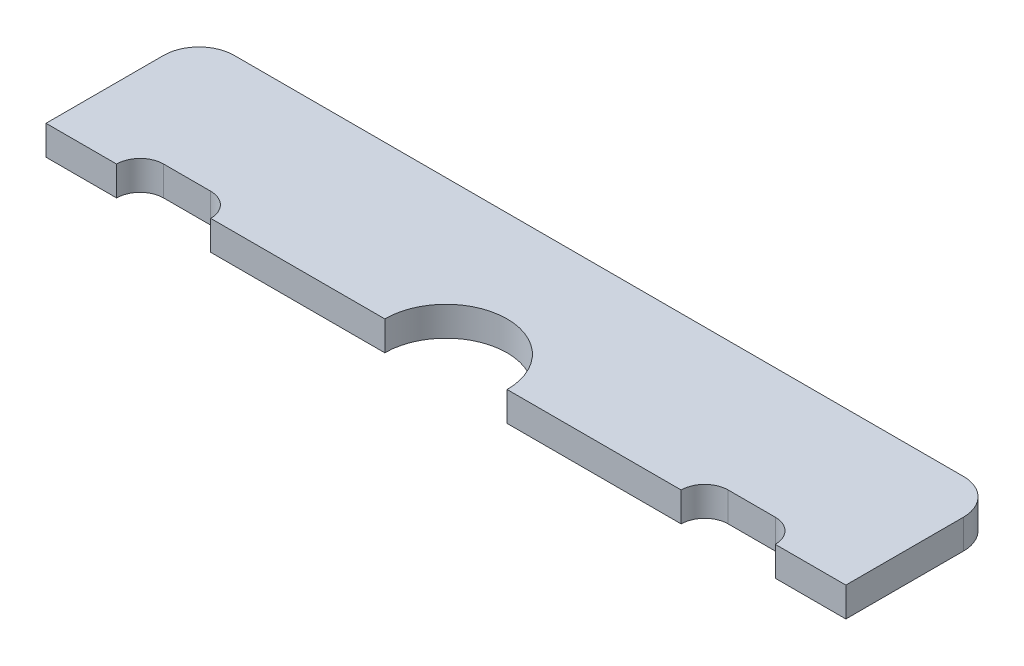
ISO-10303-21;
HEADER;
FILE_DESCRIPTION(('STEP AP214'),'2;1');
FILE_NAME('part.step','',(''),(''),'','','');
FILE_SCHEMA(('AUTOMOTIVE_DESIGN { 1 0 10303 214 1 1 1 1 }'));
ENDSEC;
DATA;
#1=APPLICATION_CONTEXT('core data for automotive mechanical design processes');
#2=APPLICATION_PROTOCOL_DEFINITION('international standard','automotive_design',2000,#1);
#3=PRODUCT_CONTEXT('',#1,'mechanical');
#4=PRODUCT('Part','Part','',(#3));
#5=PRODUCT_RELATED_PRODUCT_CATEGORY('part','',(#4));
#6=PRODUCT_DEFINITION_FORMATION('','',#4);
#7=PRODUCT_DEFINITION_CONTEXT('part definition',#1,'design');
#8=PRODUCT_DEFINITION('design','',#6,#7);
#9=PRODUCT_DEFINITION_SHAPE('','',#8);
#10=(LENGTH_UNIT() NAMED_UNIT(*) SI_UNIT(.MILLI.,.METRE.));
#11=(NAMED_UNIT(*) PLANE_ANGLE_UNIT() SI_UNIT($,.RADIAN.));
#12=(NAMED_UNIT(*) SI_UNIT($,.STERADIAN.) SOLID_ANGLE_UNIT());
#13=UNCERTAINTY_MEASURE_WITH_UNIT(LENGTH_MEASURE(1.E-05),#10,'distance_accuracy_value','');
#14=(GEOMETRIC_REPRESENTATION_CONTEXT(3) GLOBAL_UNCERTAINTY_ASSIGNED_CONTEXT((#13)) GLOBAL_UNIT_ASSIGNED_CONTEXT((#10,
#11,#12)) REPRESENTATION_CONTEXT('',''));
#15=CARTESIAN_POINT('',(0.,0.,0.));
#16=DIRECTION('',(0.,0.,1.));
#17=DIRECTION('',(1.,0.,0.));
#18=AXIS2_PLACEMENT_3D('',#15,#16,#17);
#19=CARTESIAN_POINT('',(-17.,1.25,0.));
#20=DIRECTION('',(0.,0.,-1.));
#21=DIRECTION('',(-1.,0.,0.));
#22=AXIS2_PLACEMENT_3D('',#19,#20,#21);
#23=PLANE('',#22);
#24=DIRECTION('',(1.,0.,0.));
#25=VECTOR('',#24,1.);
#26=CARTESIAN_POINT('',(-17.,0.,0.));
#27=LINE('',#26,#25);
#28=CARTESIAN_POINT('',(-17.,0.,0.));
#29=VERTEX_POINT('',#28);
#30=CARTESIAN_POINT('',(-14.,0.,0.));
#31=VERTEX_POINT('',#30);
#32=EDGE_CURVE('E188',#29,#31,#27,.T.);
#33=ORIENTED_EDGE('',*,*,#32,.T.);
#34=DIRECTION('',(0.,-1.,0.));
#35=VECTOR('',#34,1.);
#36=CARTESIAN_POINT('',(-14.,1.25,0.));
#37=LINE('',#36,#35);
#38=CARTESIAN_POINT('',(-14.,1.25,0.));
#39=VERTEX_POINT('',#38);
#40=EDGE_CURVE('E11',#39,#31,#37,.T.);
#41=ORIENTED_EDGE('',*,*,#40,.F.);
#42=DIRECTION('',(1.,0.,0.));
#43=VECTOR('',#42,1.);
#44=CARTESIAN_POINT('',(-17.,1.25,0.));
#45=LINE('',#44,#43);
#46=CARTESIAN_POINT('',(-17.,1.25,0.));
#47=VERTEX_POINT('',#46);
#48=EDGE_CURVE('E234',#47,#39,#45,.T.);
#49=ORIENTED_EDGE('',*,*,#48,.F.);
#50=DIRECTION('',(0.,-1.,0.));
#51=VECTOR('',#50,1.);
#52=CARTESIAN_POINT('',(-17.,1.25,0.));
#53=LINE('',#52,#51);
#54=EDGE_CURVE('E184',#47,#29,#53,.T.);
#55=ORIENTED_EDGE('',*,*,#54,.T.);
#56=EDGE_LOOP('',(#33,#41,#49,#55));
#57=FACE_BOUND('',#56,.T.);
#58=ADVANCED_FACE('F39',(#57),#23,.F.);
#59=CARTESIAN_POINT('',(-13.,1.25,0.));
#60=DIRECTION('',(0.,-1.,0.));
#61=DIRECTION('',(0.,0.,-1.));
#62=AXIS2_PLACEMENT_3D('',#59,#60,#61);
#63=CYLINDRICAL_SURFACE('',#62,1.);
#64=CARTESIAN_POINT('',(-13.,0.,0.));
#65=DIRECTION('',(0.,-1.,0.));
#66=DIRECTION('',(0.,0.,1.));
#67=AXIS2_PLACEMENT_3D('',#64,#65,#66);
#68=CIRCLE('',#67,1.);
#69=CARTESIAN_POINT('',(-13.,0.,-1.));
#70=VERTEX_POINT('',#69);
#71=EDGE_CURVE('E192',#31,#70,#68,.T.);
#72=ORIENTED_EDGE('',*,*,#71,.T.);
#73=DIRECTION('',(0.,-1.,0.));
#74=VECTOR('',#73,1.);
#75=CARTESIAN_POINT('',(-13.,1.25,-1.));
#76=LINE('',#75,#74);
#77=CARTESIAN_POINT('',(-13.,1.25,-1.));
#78=VERTEX_POINT('',#77);
#79=EDGE_CURVE('E48',#78,#70,#76,.T.);
#80=ORIENTED_EDGE('',*,*,#79,.F.);
#81=CARTESIAN_POINT('',(-13.,1.25,0.));
#82=DIRECTION('',(0.,-1.,0.));
#83=DIRECTION('',(0.,0.,1.));
#84=AXIS2_PLACEMENT_3D('',#81,#82,#83);
#85=CIRCLE('',#84,1.);
#86=EDGE_CURVE('E123',#39,#78,#85,.T.);
#87=ORIENTED_EDGE('',*,*,#86,.F.);
#88=ORIENTED_EDGE('',*,*,#40,.T.);
#89=EDGE_LOOP('',(#72,#80,#87,#88));
#90=FACE_BOUND('',#89,.T.);
#91=ADVANCED_FACE('F356',(#90),#63,.F.);
#92=CARTESIAN_POINT('',(-13.,1.25,-1.));
#93=DIRECTION('',(0.,0.,-1.));
#94=DIRECTION('',(-1.,0.,0.));
#95=AXIS2_PLACEMENT_3D('',#92,#93,#94);
#96=PLANE('',#95);
#97=DIRECTION('',(1.,0.,0.));
#98=VECTOR('',#97,1.);
#99=CARTESIAN_POINT('',(-13.,0.,-1.));
#100=LINE('',#99,#98);
#101=CARTESIAN_POINT('',(-11.,0.,-1.));
#102=VERTEX_POINT('',#101);
#103=EDGE_CURVE('E195',#70,#102,#100,.T.);
#104=ORIENTED_EDGE('',*,*,#103,.T.);
#105=DIRECTION('',(0.,-1.,0.));
#106=VECTOR('',#105,1.);
#107=CARTESIAN_POINT('',(-11.,1.25,-1.));
#108=LINE('',#107,#106);
#109=CARTESIAN_POINT('',(-11.,1.25,-1.));
#110=VERTEX_POINT('',#109);
#111=EDGE_CURVE('E277',#110,#102,#108,.T.);
#112=ORIENTED_EDGE('',*,*,#111,.F.);
#113=DIRECTION('',(1.,0.,0.));
#114=VECTOR('',#113,1.);
#115=CARTESIAN_POINT('',(-13.,1.25,-1.));
#116=LINE('',#115,#114);
#117=EDGE_CURVE('E287',#78,#110,#116,.T.);
#118=ORIENTED_EDGE('',*,*,#117,.F.);
#119=ORIENTED_EDGE('',*,*,#79,.T.);
#120=EDGE_LOOP('',(#104,#112,#118,#119));
#121=FACE_BOUND('',#120,.T.);
#122=ADVANCED_FACE('F285',(#121),#96,.F.);
#123=CARTESIAN_POINT('',(-11.,1.25,0.));
#124=DIRECTION('',(0.,-1.,0.));
#125=DIRECTION('',(0.,0.,-1.));
#126=AXIS2_PLACEMENT_3D('',#123,#124,#125);
#127=CYLINDRICAL_SURFACE('',#126,1.);
#128=CARTESIAN_POINT('',(-11.,0.,0.));
#129=DIRECTION('',(0.,-1.,0.));
#130=DIRECTION('',(0.,0.,1.));
#131=AXIS2_PLACEMENT_3D('',#128,#129,#130);
#132=CIRCLE('',#131,1.);
#133=CARTESIAN_POINT('',(-9.99999999999998,0.,0.));
#134=VERTEX_POINT('',#133);
#135=EDGE_CURVE('E198',#102,#134,#132,.T.);
#136=ORIENTED_EDGE('',*,*,#135,.T.);
#137=DIRECTION('',(0.,-1.,0.));
#138=VECTOR('',#137,1.);
#139=CARTESIAN_POINT('',(-9.99999999999998,1.25,0.));
#140=LINE('',#139,#138);
#141=CARTESIAN_POINT('',(-9.99999999999998,1.25,0.));
#142=VERTEX_POINT('',#141);
#143=EDGE_CURVE('E273',#142,#134,#140,.T.);
#144=ORIENTED_EDGE('',*,*,#143,.F.);
#145=CARTESIAN_POINT('',(-11.,1.25,0.));
#146=DIRECTION('',(0.,-1.,0.));
#147=DIRECTION('',(0.,0.,1.));
#148=AXIS2_PLACEMENT_3D('',#145,#146,#147);
#149=CIRCLE('',#148,1.);
#150=EDGE_CURVE('E306',#110,#142,#149,.T.);
#151=ORIENTED_EDGE('',*,*,#150,.F.);
#152=ORIENTED_EDGE('',*,*,#111,.T.);
#153=EDGE_LOOP('',(#136,#144,#151,#152));
#154=FACE_BOUND('',#153,.T.);
#155=ADVANCED_FACE('F296',(#154),#127,.F.);
#156=CARTESIAN_POINT('',(-9.99999999999998,1.25,0.));
#157=DIRECTION('',(0.,0.,-1.));
#158=DIRECTION('',(-1.,0.,0.));
#159=AXIS2_PLACEMENT_3D('',#156,#157,#158);
#160=PLANE('',#159);
#161=DIRECTION('',(1.,0.,0.));
#162=VECTOR('',#161,1.);
#163=CARTESIAN_POINT('',(-9.99999999999998,0.,0.));
#164=LINE('',#163,#162);
#165=CARTESIAN_POINT('',(-2.60000000000001,0.,0.));
#166=VERTEX_POINT('',#165);
#167=EDGE_CURVE('E201',#134,#166,#164,.T.);
#168=ORIENTED_EDGE('',*,*,#167,.T.);
#169=DIRECTION('',(0.,-1.,0.));
#170=VECTOR('',#169,1.);
#171=CARTESIAN_POINT('',(-2.60000000000001,1.25,0.));
#172=LINE('',#171,#170);
#173=CARTESIAN_POINT('',(-2.60000000000001,1.25,0.));
#174=VERTEX_POINT('',#173);
#175=EDGE_CURVE('E269',#174,#166,#172,.T.);
#176=ORIENTED_EDGE('',*,*,#175,.F.);
#177=DIRECTION('',(1.,0.,0.));
#178=VECTOR('',#177,1.);
#179=CARTESIAN_POINT('',(-9.99999999999998,1.25,0.));
#180=LINE('',#179,#178);
#181=EDGE_CURVE('E302',#142,#174,#180,.T.);
#182=ORIENTED_EDGE('',*,*,#181,.F.);
#183=ORIENTED_EDGE('',*,*,#143,.T.);
#184=EDGE_LOOP('',(#168,#176,#182,#183));
#185=FACE_BOUND('',#184,.T.);
#186=ADVANCED_FACE('F300',(#185),#160,.F.);
#187=CARTESIAN_POINT('',(0.,1.25,0.));
#188=DIRECTION('',(0.,-1.,0.));
#189=DIRECTION('',(0.,0.,-1.));
#190=AXIS2_PLACEMENT_3D('',#187,#188,#189);
#191=CYLINDRICAL_SURFACE('',#190,2.6);
#192=CARTESIAN_POINT('',(0.,0.,0.));
#193=DIRECTION('',(0.,-1.,0.));
#194=DIRECTION('',(0.,0.,1.));
#195=AXIS2_PLACEMENT_3D('',#192,#193,#194);
#196=CIRCLE('',#195,2.6);
#197=CARTESIAN_POINT('',(2.59999999999999,0.,0.));
#198=VERTEX_POINT('',#197);
#199=EDGE_CURVE('E204',#166,#198,#196,.T.);
#200=ORIENTED_EDGE('',*,*,#199,.T.);
#201=DIRECTION('',(0.,-1.,0.));
#202=VECTOR('',#201,1.);
#203=CARTESIAN_POINT('',(2.59999999999999,1.25,0.));
#204=LINE('',#203,#202);
#205=CARTESIAN_POINT('',(2.59999999999999,1.25,0.));
#206=VERTEX_POINT('',#205);
#207=EDGE_CURVE('E265',#206,#198,#204,.T.);
#208=ORIENTED_EDGE('',*,*,#207,.F.);
#209=CARTESIAN_POINT('',(0.,1.25,0.));
#210=DIRECTION('',(0.,-1.,0.));
#211=DIRECTION('',(0.,0.,1.));
#212=AXIS2_PLACEMENT_3D('',#209,#210,#211);
#213=CIRCLE('',#212,2.6);
#214=EDGE_CURVE('E305',#174,#206,#213,.T.);
#215=ORIENTED_EDGE('',*,*,#214,.F.);
#216=ORIENTED_EDGE('',*,*,#175,.T.);
#217=EDGE_LOOP('',(#200,#208,#215,#216));
#218=FACE_BOUND('',#217,.T.);
#219=ADVANCED_FACE('F369',(#218),#191,.F.);
#220=CARTESIAN_POINT('',(2.59999999999999,1.25,0.));
#221=DIRECTION('',(0.,0.,-1.));
#222=DIRECTION('',(-1.,0.,0.));
#223=AXIS2_PLACEMENT_3D('',#220,#221,#222);
#224=PLANE('',#223);
#225=DIRECTION('',(1.,0.,0.));
#226=VECTOR('',#225,1.);
#227=CARTESIAN_POINT('',(2.59999999999999,0.,0.));
#228=LINE('',#227,#226);
#229=CARTESIAN_POINT('',(9.99999999999998,0.,0.));
#230=VERTEX_POINT('',#229);
#231=EDGE_CURVE('E207',#198,#230,#228,.T.);
#232=ORIENTED_EDGE('',*,*,#231,.T.);
#233=DIRECTION('',(0.,-1.,0.));
#234=VECTOR('',#233,1.);
#235=CARTESIAN_POINT('',(9.99999999999998,1.25,0.));
#236=LINE('',#235,#234);
#237=CARTESIAN_POINT('',(9.99999999999998,1.25,0.));
#238=VERTEX_POINT('',#237);
#239=EDGE_CURVE('E261',#238,#230,#236,.T.);
#240=ORIENTED_EDGE('',*,*,#239,.F.);
#241=DIRECTION('',(1.,0.,0.));
#242=VECTOR('',#241,1.);
#243=CARTESIAN_POINT('',(2.59999999999999,1.25,0.));
#244=LINE('',#243,#242);
#245=EDGE_CURVE('E310',#206,#238,#244,.T.);
#246=ORIENTED_EDGE('',*,*,#245,.F.);
#247=ORIENTED_EDGE('',*,*,#207,.T.);
#248=EDGE_LOOP('',(#232,#240,#246,#247));
#249=FACE_BOUND('',#248,.T.);
#250=ADVANCED_FACE('F372',(#249),#224,.F.);
#251=CARTESIAN_POINT('',(11.,1.25,0.));
#252=DIRECTION('',(0.,-1.,0.));
#253=DIRECTION('',(0.,0.,-1.));
#254=AXIS2_PLACEMENT_3D('',#251,#252,#253);
#255=CYLINDRICAL_SURFACE('',#254,1.);
#256=CARTESIAN_POINT('',(11.,0.,0.));
#257=DIRECTION('',(0.,-1.,0.));
#258=DIRECTION('',(0.,0.,1.));
#259=AXIS2_PLACEMENT_3D('',#256,#257,#258);
#260=CIRCLE('',#259,1.);
#261=CARTESIAN_POINT('',(11.,0.,-1.));
#262=VERTEX_POINT('',#261);
#263=EDGE_CURVE('E210',#230,#262,#260,.T.);
#264=ORIENTED_EDGE('',*,*,#263,.T.);
#265=DIRECTION('',(0.,-1.,0.));
#266=VECTOR('',#265,1.);
#267=CARTESIAN_POINT('',(11.,1.25,-1.));
#268=LINE('',#267,#266);
#269=CARTESIAN_POINT('',(11.,1.25,-1.));
#270=VERTEX_POINT('',#269);
#271=EDGE_CURVE('E257',#270,#262,#268,.T.);
#272=ORIENTED_EDGE('',*,*,#271,.F.);
#273=CARTESIAN_POINT('',(11.,1.25,0.));
#274=DIRECTION('',(0.,-1.,0.));
#275=DIRECTION('',(0.,0.,1.));
#276=AXIS2_PLACEMENT_3D('',#273,#274,#275);
#277=CIRCLE('',#276,1.);
#278=EDGE_CURVE('E317',#238,#270,#277,.T.);
#279=ORIENTED_EDGE('',*,*,#278,.F.);
#280=ORIENTED_EDGE('',*,*,#239,.T.);
#281=EDGE_LOOP('',(#264,#272,#279,#280));
#282=FACE_BOUND('',#281,.T.);
#283=ADVANCED_FACE('F376',(#282),#255,.F.);
#284=CARTESIAN_POINT('',(11.,1.25,-1.));
#285=DIRECTION('',(0.,0.,-1.));
#286=DIRECTION('',(-1.,0.,0.));
#287=AXIS2_PLACEMENT_3D('',#284,#285,#286);
#288=PLANE('',#287);
#289=DIRECTION('',(1.,0.,0.));
#290=VECTOR('',#289,1.);
#291=CARTESIAN_POINT('',(11.,0.,-1.));
#292=LINE('',#291,#290);
#293=CARTESIAN_POINT('',(13.,0.,-0.999999999999999));
#294=VERTEX_POINT('',#293);
#295=EDGE_CURVE('E213',#262,#294,#292,.T.);
#296=ORIENTED_EDGE('',*,*,#295,.T.);
#297=DIRECTION('',(0.,-1.,0.));
#298=VECTOR('',#297,1.);
#299=CARTESIAN_POINT('',(13.,1.25,-0.999999999999999));
#300=LINE('',#299,#298);
#301=CARTESIAN_POINT('',(13.,1.25,-0.999999999999999));
#302=VERTEX_POINT('',#301);
#303=EDGE_CURVE('E253',#302,#294,#300,.T.);
#304=ORIENTED_EDGE('',*,*,#303,.F.);
#305=DIRECTION('',(1.,0.,0.));
#306=VECTOR('',#305,1.);
#307=CARTESIAN_POINT('',(11.,1.25,-1.));
#308=LINE('',#307,#306);
#309=EDGE_CURVE('E320',#270,#302,#308,.T.);
#310=ORIENTED_EDGE('',*,*,#309,.F.);
#311=ORIENTED_EDGE('',*,*,#271,.T.);
#312=EDGE_LOOP('',(#296,#304,#310,#311));
#313=FACE_BOUND('',#312,.T.);
#314=ADVANCED_FACE('F380',(#313),#288,.F.);
#315=CARTESIAN_POINT('',(13.,1.25,0.));
#316=DIRECTION('',(0.,-1.,0.));
#317=DIRECTION('',(0.,0.,-1.));
#318=AXIS2_PLACEMENT_3D('',#315,#316,#317);
#319=CYLINDRICAL_SURFACE('',#318,0.999999999999999);
#320=CARTESIAN_POINT('',(13.,0.,0.));
#321=DIRECTION('',(0.,-1.,0.));
#322=DIRECTION('',(0.,0.,1.));
#323=AXIS2_PLACEMENT_3D('',#320,#321,#322);
#324=CIRCLE('',#323,0.999999999999999);
#325=CARTESIAN_POINT('',(14.,0.,0.));
#326=VERTEX_POINT('',#325);
#327=EDGE_CURVE('E216',#294,#326,#324,.T.);
#328=ORIENTED_EDGE('',*,*,#327,.T.);
#329=DIRECTION('',(0.,-1.,0.));
#330=VECTOR('',#329,1.);
#331=CARTESIAN_POINT('',(14.,1.25,0.));
#332=LINE('',#331,#330);
#333=CARTESIAN_POINT('',(14.,1.25,0.));
#334=VERTEX_POINT('',#333);
#335=EDGE_CURVE('E249',#334,#326,#332,.T.);
#336=ORIENTED_EDGE('',*,*,#335,.F.);
#337=CARTESIAN_POINT('',(13.,1.25,0.));
#338=DIRECTION('',(0.,-1.,0.));
#339=DIRECTION('',(0.,0.,1.));
#340=AXIS2_PLACEMENT_3D('',#337,#338,#339);
#341=CIRCLE('',#340,0.999999999999999);
#342=EDGE_CURVE('E323',#302,#334,#341,.T.);
#343=ORIENTED_EDGE('',*,*,#342,.F.);
#344=ORIENTED_EDGE('',*,*,#303,.T.);
#345=EDGE_LOOP('',(#328,#336,#343,#344));
#346=FACE_BOUND('',#345,.T.);
#347=ADVANCED_FACE('F384',(#346),#319,.F.);
#348=CARTESIAN_POINT('',(14.,1.25,0.));
#349=DIRECTION('',(0.,0.,-1.));
#350=DIRECTION('',(-1.,0.,0.));
#351=AXIS2_PLACEMENT_3D('',#348,#349,#350);
#352=PLANE('',#351);
#353=DIRECTION('',(1.,0.,0.));
#354=VECTOR('',#353,1.);
#355=CARTESIAN_POINT('',(14.,0.,0.));
#356=LINE('',#355,#354);
#357=CARTESIAN_POINT('',(17.,0.,0.));
#358=VERTEX_POINT('',#357);
#359=EDGE_CURVE('E219',#326,#358,#356,.T.);
#360=ORIENTED_EDGE('',*,*,#359,.T.);
#361=DIRECTION('',(0.,-1.,0.));
#362=VECTOR('',#361,1.);
#363=CARTESIAN_POINT('',(17.,1.25,0.));
#364=LINE('',#363,#362);
#365=CARTESIAN_POINT('',(17.,1.25,0.));
#366=VERTEX_POINT('',#365);
#367=EDGE_CURVE('E245',#366,#358,#364,.T.);
#368=ORIENTED_EDGE('',*,*,#367,.F.);
#369=DIRECTION('',(1.,0.,0.));
#370=VECTOR('',#369,1.);
#371=CARTESIAN_POINT('',(14.,1.25,0.));
#372=LINE('',#371,#370);
#373=EDGE_CURVE('E326',#334,#366,#372,.T.);
#374=ORIENTED_EDGE('',*,*,#373,.F.);
#375=ORIENTED_EDGE('',*,*,#335,.T.);
#376=EDGE_LOOP('',(#360,#368,#374,#375));
#377=FACE_BOUND('',#376,.T.);
#378=ADVANCED_FACE('F388',(#377),#352,.F.);
#379=CARTESIAN_POINT('',(17.,1.25,-4.99999999999999));
#380=DIRECTION('',(-1.,0.,0.));
#381=DIRECTION('',(0.,0.,1.));
#382=AXIS2_PLACEMENT_3D('',#379,#380,#381);
#383=PLANE('',#382);
#384=DIRECTION('',(0.,0.,-1.));
#385=VECTOR('',#384,1.);
#386=CARTESIAN_POINT('',(17.,0.,-4.99999999999999));
#387=LINE('',#386,#385);
#388=CARTESIAN_POINT('',(17.,0.,-4.99999999999999));
#389=VERTEX_POINT('',#388);
#390=EDGE_CURVE('E222',#358,#389,#387,.T.);
#391=ORIENTED_EDGE('',*,*,#390,.T.);
#392=DIRECTION('',(0.,-1.,0.));
#393=VECTOR('',#392,1.);
#394=CARTESIAN_POINT('',(17.,1.25,-4.99999999999999));
#395=LINE('',#394,#393);
#396=CARTESIAN_POINT('',(17.,1.25,-4.99999999999999));
#397=VERTEX_POINT('',#396);
#398=EDGE_CURVE('E241',#397,#389,#395,.T.);
#399=ORIENTED_EDGE('',*,*,#398,.F.);
#400=DIRECTION('',(0.,0.,-1.));
#401=VECTOR('',#400,1.);
#402=CARTESIAN_POINT('',(17.,1.25,-4.99999999999999));
#403=LINE('',#402,#401);
#404=EDGE_CURVE('E329',#366,#397,#403,.T.);
#405=ORIENTED_EDGE('',*,*,#404,.F.);
#406=ORIENTED_EDGE('',*,*,#367,.T.);
#407=EDGE_LOOP('',(#391,#399,#405,#406));
#408=FACE_BOUND('',#407,.T.);
#409=ADVANCED_FACE('F337',(#408),#383,.F.);
#410=CARTESIAN_POINT('',(15.5,1.25,-5.));
#411=DIRECTION('',(0.,-1.,0.));
#412=DIRECTION('',(0.,0.,-1.));
#413=AXIS2_PLACEMENT_3D('',#410,#411,#412);
#414=CYLINDRICAL_SURFACE('',#413,1.5);
#415=CARTESIAN_POINT('',(15.5,0.,-5.));
#416=DIRECTION('',(0.,1.,0.));
#417=DIRECTION('',(0.,0.,-1.));
#418=AXIS2_PLACEMENT_3D('',#415,#416,#417);
#419=CIRCLE('',#418,1.5);
#420=CARTESIAN_POINT('',(15.5,0.,-6.5));
#421=VERTEX_POINT('',#420);
#422=EDGE_CURVE('E225',#389,#421,#419,.T.);
#423=ORIENTED_EDGE('',*,*,#422,.T.);
#424=DIRECTION('',(0.,-1.,0.));
#425=VECTOR('',#424,1.);
#426=CARTESIAN_POINT('',(15.5,1.25,-6.5));
#427=LINE('',#426,#425);
#428=CARTESIAN_POINT('',(15.5,1.25,-6.5));
#429=VERTEX_POINT('',#428);
#430=EDGE_CURVE('E177',#429,#421,#427,.T.);
#431=ORIENTED_EDGE('',*,*,#430,.F.);
#432=CARTESIAN_POINT('',(15.5,1.25,-5.));
#433=DIRECTION('',(0.,1.,0.));
#434=DIRECTION('',(0.,0.,-1.));
#435=AXIS2_PLACEMENT_3D('',#432,#433,#434);
#436=CIRCLE('',#435,1.5);
#437=EDGE_CURVE('E166',#397,#429,#436,.T.);
#438=ORIENTED_EDGE('',*,*,#437,.F.);
#439=ORIENTED_EDGE('',*,*,#398,.T.);
#440=EDGE_LOOP('',(#423,#431,#438,#439));
#441=FACE_BOUND('',#440,.T.);
#442=ADVANCED_FACE('F341',(#441),#414,.T.);
#443=CARTESIAN_POINT('',(-15.5,1.25,-6.5));
#444=DIRECTION('',(0.,0.,1.));
#445=DIRECTION('',(1.,0.,0.));
#446=AXIS2_PLACEMENT_3D('',#443,#444,#445);
#447=PLANE('',#446);
#448=DIRECTION('',(-1.,0.,0.));
#449=VECTOR('',#448,1.);
#450=CARTESIAN_POINT('',(-15.5,0.,-6.5));
#451=LINE('',#450,#449);
#452=CARTESIAN_POINT('',(-15.5,0.,-6.5));
#453=VERTEX_POINT('',#452);
#454=EDGE_CURVE('E175',#421,#453,#451,.T.);
#455=ORIENTED_EDGE('',*,*,#454,.T.);
#456=DIRECTION('',(0.,-1.,0.));
#457=VECTOR('',#456,1.);
#458=CARTESIAN_POINT('',(-15.5,1.25,-6.5));
#459=LINE('',#458,#457);
#460=CARTESIAN_POINT('',(-15.5,1.25,-6.5));
#461=VERTEX_POINT('',#460);
#462=EDGE_CURVE('E172',#461,#453,#459,.T.);
#463=ORIENTED_EDGE('',*,*,#462,.F.);
#464=DIRECTION('',(-1.,0.,0.));
#465=VECTOR('',#464,1.);
#466=CARTESIAN_POINT('',(-15.5,1.25,-6.5));
#467=LINE('',#466,#465);
#468=EDGE_CURVE('E160',#429,#461,#467,.T.);
#469=ORIENTED_EDGE('',*,*,#468,.F.);
#470=ORIENTED_EDGE('',*,*,#430,.T.);
#471=EDGE_LOOP('',(#455,#463,#469,#470));
#472=FACE_BOUND('',#471,.T.);
#473=ADVANCED_FACE('F173',(#472),#447,.F.);
#474=CARTESIAN_POINT('',(-15.5,1.25,-5.));
#475=DIRECTION('',(0.,-1.,0.));
#476=DIRECTION('',(0.,0.,-1.));
#477=AXIS2_PLACEMENT_3D('',#474,#475,#476);
#478=CYLINDRICAL_SURFACE('',#477,1.5);
#479=CARTESIAN_POINT('',(-15.5,0.,-5.));
#480=DIRECTION('',(0.,1.,0.));
#481=DIRECTION('',(0.,0.,1.));
#482=AXIS2_PLACEMENT_3D('',#479,#480,#481);
#483=CIRCLE('',#482,1.5);
#484=CARTESIAN_POINT('',(-17.,0.,-4.99999999999999));
#485=VERTEX_POINT('',#484);
#486=EDGE_CURVE('E109',#453,#485,#483,.T.);
#487=ORIENTED_EDGE('',*,*,#486,.T.);
#488=DIRECTION('',(0.,-1.,0.));
#489=VECTOR('',#488,1.);
#490=CARTESIAN_POINT('',(-17.,1.25,-4.99999999999999));
#491=LINE('',#490,#489);
#492=CARTESIAN_POINT('',(-17.,1.25,-4.99999999999999));
#493=VERTEX_POINT('',#492);
#494=EDGE_CURVE('E178',#493,#485,#491,.T.);
#495=ORIENTED_EDGE('',*,*,#494,.F.);
#496=CARTESIAN_POINT('',(-15.5,1.25,-5.));
#497=DIRECTION('',(0.,1.,0.));
#498=DIRECTION('',(0.,0.,1.));
#499=AXIS2_PLACEMENT_3D('',#496,#497,#498);
#500=CIRCLE('',#499,1.5);
#501=EDGE_CURVE('E164',#461,#493,#500,.T.);
#502=ORIENTED_EDGE('',*,*,#501,.F.);
#503=ORIENTED_EDGE('',*,*,#462,.T.);
#504=EDGE_LOOP('',(#487,#495,#502,#503));
#505=FACE_BOUND('',#504,.T.);
#506=ADVANCED_FACE('F180',(#505),#478,.T.);
#507=CARTESIAN_POINT('',(-17.,1.25,-4.99999999999999));
#508=DIRECTION('',(1.,0.,0.));
#509=DIRECTION('',(0.,0.,-1.));
#510=AXIS2_PLACEMENT_3D('',#507,#508,#509);
#511=PLANE('',#510);
#512=DIRECTION('',(0.,0.,1.));
#513=VECTOR('',#512,1.);
#514=CARTESIAN_POINT('',(-17.,0.,-4.99999999999999));
#515=LINE('',#514,#513);
#516=EDGE_CURVE('E115',#485,#29,#515,.T.);
#517=ORIENTED_EDGE('',*,*,#516,.T.);
#518=ORIENTED_EDGE('',*,*,#54,.F.);
#519=DIRECTION('',(0.,0.,1.));
#520=VECTOR('',#519,1.);
#521=CARTESIAN_POINT('',(-17.,1.25,-4.99999999999999));
#522=LINE('',#521,#520);
#523=EDGE_CURVE('E56',#493,#47,#522,.T.);
#524=ORIENTED_EDGE('',*,*,#523,.F.);
#525=ORIENTED_EDGE('',*,*,#494,.T.);
#526=EDGE_LOOP('',(#517,#518,#524,#525));
#527=FACE_BOUND('',#526,.T.);
#528=ADVANCED_FACE('F345',(#527),#511,.F.);
#529=CARTESIAN_POINT('',(-13.,1.25,0.));
#530=DIRECTION('',(0.,1.,0.));
#531=DIRECTION('',(0.,0.,1.));
#532=AXIS2_PLACEMENT_3D('',#529,#530,#531);
#533=PLANE('',#532);
#534=ORIENTED_EDGE('',*,*,#48,.T.);
#535=ORIENTED_EDGE('',*,*,#86,.T.);
#536=ORIENTED_EDGE('',*,*,#117,.T.);
#537=ORIENTED_EDGE('',*,*,#150,.T.);
#538=ORIENTED_EDGE('',*,*,#181,.T.);
#539=ORIENTED_EDGE('',*,*,#214,.T.);
#540=ORIENTED_EDGE('',*,*,#245,.T.);
#541=ORIENTED_EDGE('',*,*,#278,.T.);
#542=ORIENTED_EDGE('',*,*,#309,.T.);
#543=ORIENTED_EDGE('',*,*,#342,.T.);
#544=ORIENTED_EDGE('',*,*,#373,.T.);
#545=ORIENTED_EDGE('',*,*,#404,.T.);
#546=ORIENTED_EDGE('',*,*,#437,.T.);
#547=ORIENTED_EDGE('',*,*,#468,.T.);
#548=ORIENTED_EDGE('',*,*,#501,.T.);
#549=ORIENTED_EDGE('',*,*,#523,.T.);
#550=EDGE_LOOP('',(#534,#535,#536,#537,#538,#539,#540,#541,#542,#543,#544,#545,#546,#547,#548,#549));
#551=FACE_BOUND('',#550,.T.);
#552=ADVANCED_FACE('F162',(#551),#533,.T.);
#553=CARTESIAN_POINT('',(-13.,0.,0.));
#554=DIRECTION('',(0.,1.,0.));
#555=DIRECTION('',(0.,0.,1.));
#556=AXIS2_PLACEMENT_3D('',#553,#554,#555);
#557=PLANE('',#556);
#558=ORIENTED_EDGE('',*,*,#32,.F.);
#559=ORIENTED_EDGE('',*,*,#516,.F.);
#560=ORIENTED_EDGE('',*,*,#486,.F.);
#561=ORIENTED_EDGE('',*,*,#454,.F.);
#562=ORIENTED_EDGE('',*,*,#422,.F.);
#563=ORIENTED_EDGE('',*,*,#390,.F.);
#564=ORIENTED_EDGE('',*,*,#359,.F.);
#565=ORIENTED_EDGE('',*,*,#327,.F.);
#566=ORIENTED_EDGE('',*,*,#295,.F.);
#567=ORIENTED_EDGE('',*,*,#263,.F.);
#568=ORIENTED_EDGE('',*,*,#231,.F.);
#569=ORIENTED_EDGE('',*,*,#199,.F.);
#570=ORIENTED_EDGE('',*,*,#167,.F.);
#571=ORIENTED_EDGE('',*,*,#135,.F.);
#572=ORIENTED_EDGE('',*,*,#103,.F.);
#573=ORIENTED_EDGE('',*,*,#71,.F.);
#574=EDGE_LOOP('',(#558,#559,#560,#561,#562,#563,#564,#565,#566,#567,#568,#569,#570,#571,#572,#573));
#575=FACE_BOUND('',#574,.T.);
#576=ADVANCED_FACE('F291',(#575),#557,.F.);
#577=CLOSED_SHELL('',(#58,#91,#122,#155,#186,#219,#250,#283,#314,#347,#378,#409,#442,#473,#506,
#528,#552,#576));
#578=MANIFOLD_SOLID_BREP('B2',#577);
#579=ADVANCED_BREP_SHAPE_REPRESENTATION('',(#18,#578),#14);
#580=SHAPE_DEFINITION_REPRESENTATION(#9,#579);
ENDSEC;
END-ISO-10303-21;
